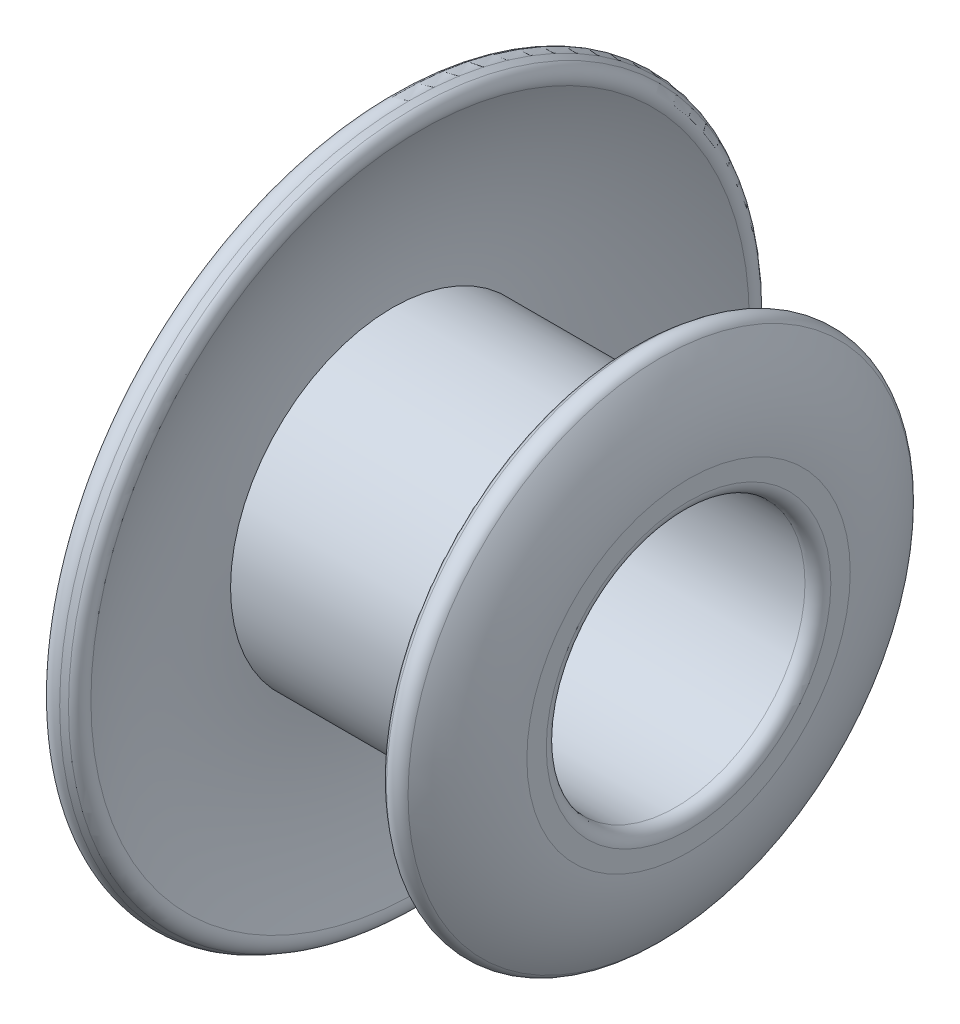
ISO-10303-21;
HEADER;
FILE_DESCRIPTION(('STEP AP214'),'2;1');
FILE_NAME('part.step','',(''),(''),'','','');
FILE_SCHEMA(('AUTOMOTIVE_DESIGN { 1 0 10303 214 1 1 1 1 }'));
ENDSEC;
DATA;
#1=APPLICATION_CONTEXT('core data for automotive mechanical design processes');
#2=APPLICATION_PROTOCOL_DEFINITION('international standard','automotive_design',2000,#1);
#3=PRODUCT_CONTEXT('',#1,'mechanical');
#4=PRODUCT('Part','Part','',(#3));
#5=PRODUCT_RELATED_PRODUCT_CATEGORY('part','',(#4));
#6=PRODUCT_DEFINITION_FORMATION('','',#4);
#7=PRODUCT_DEFINITION_CONTEXT('part definition',#1,'design');
#8=PRODUCT_DEFINITION('design','',#6,#7);
#9=PRODUCT_DEFINITION_SHAPE('','',#8);
#10=(LENGTH_UNIT() NAMED_UNIT(*) SI_UNIT(.MILLI.,.METRE.));
#11=(NAMED_UNIT(*) PLANE_ANGLE_UNIT() SI_UNIT($,.RADIAN.));
#12=(NAMED_UNIT(*) SI_UNIT($,.STERADIAN.) SOLID_ANGLE_UNIT());
#13=UNCERTAINTY_MEASURE_WITH_UNIT(LENGTH_MEASURE(1.E-05),#10,'distance_accuracy_value','');
#14=(GEOMETRIC_REPRESENTATION_CONTEXT(3) GLOBAL_UNCERTAINTY_ASSIGNED_CONTEXT((#13)) GLOBAL_UNIT_ASSIGNED_CONTEXT((#10,
#11,#12)) REPRESENTATION_CONTEXT('',''));
#15=CARTESIAN_POINT('',(0.,0.,0.));
#16=DIRECTION('',(0.,0.,1.));
#17=DIRECTION('',(1.,0.,0.));
#18=AXIS2_PLACEMENT_3D('',#15,#16,#17);
#19=CARTESIAN_POINT('',(-1.,0.,0.));
#20=DIRECTION('',(1.,0.,0.));
#21=DIRECTION('',(0.,0.,-1.));
#22=AXIS2_PLACEMENT_3D('',#19,#20,#21);
#23=TOROIDAL_SURFACE('',#22,1.25,1.);
#24=CARTESIAN_POINT('',(-0.170578942903163,0.,0.));
#25=DIRECTION('',(-1.,0.,0.));
#26=DIRECTION('',(0.,0.,1.));
#27=AXIS2_PLACEMENT_3D('',#24,#25,#26);
#28=CIRCLE('',#27,1.80862394331461);
#29=CARTESIAN_POINT('',(-0.170578942903163,0.,1.80862394331461));
#30=VERTEX_POINT('',#29);
#31=EDGE_CURVE('E47',#30,#30,#28,.T.);
#32=ORIENTED_EDGE('',*,*,#31,.T.);
#33=EDGE_LOOP('',(#32));
#34=FACE_BOUND('',#33,.T.);
#35=CARTESIAN_POINT('',(0.,0.,0.));
#36=DIRECTION('',(1.,0.,0.));
#37=DIRECTION('',(0.,0.,-1.));
#38=AXIS2_PLACEMENT_3D('',#35,#36,#37);
#39=CIRCLE('',#38,1.25);
#40=CARTESIAN_POINT('',(0.,0.,-1.25));
#41=VERTEX_POINT('',#40);
#42=EDGE_CURVE('E76',#41,#41,#39,.T.);
#43=ORIENTED_EDGE('',*,*,#42,.T.);
#44=EDGE_LOOP('',(#43));
#45=FACE_BOUND('',#44,.T.);
#46=ADVANCED_FACE('F32',(#34,#45),#23,.F.);
#47=CARTESIAN_POINT('',(0.,0.,0.));
#48=DIRECTION('',(1.,0.,0.));
#49=DIRECTION('',(0.,0.,-1.));
#50=AXIS2_PLACEMENT_3D('',#47,#48,#49);
#51=CYLINDRICAL_SURFACE('',#50,1.25);
#52=CARTESIAN_POINT('',(-2.04063984282907,0.,0.));
#53=DIRECTION('',(1.,0.,0.));
#54=DIRECTION('',(0.,0.,-1.));
#55=AXIS2_PLACEMENT_3D('',#52,#53,#54);
#56=CIRCLE('',#55,1.25);
#57=CARTESIAN_POINT('',(-2.04063984282907,0.,-1.25));
#58=VERTEX_POINT('',#57);
#59=EDGE_CURVE('E79',#58,#58,#56,.T.);
#60=ORIENTED_EDGE('',*,*,#59,.T.);
#61=EDGE_LOOP('',(#60));
#62=FACE_BOUND('',#61,.T.);
#63=ORIENTED_EDGE('',*,*,#42,.F.);
#64=EDGE_LOOP('',(#63));
#65=FACE_BOUND('',#64,.T.);
#66=ADVANCED_FACE('F104',(#62,#65),#51,.T.);
#67=CARTESIAN_POINT('',(0.190032397181517,0.,0.));
#68=DIRECTION('',(1.,0.,0.));
#69=DIRECTION('',(0.,0.,-1.));
#70=AXIS2_PLACEMENT_3D('',#67,#68,#69);
#71=DEGENERATE_TOROIDAL_SURFACE('',#70,1.54428108611693,2.25,.T.);
#72=CARTESIAN_POINT('',(-1.82538787646011,0.,0.));
#73=DIRECTION('',(1.,0.,0.));
#74=DIRECTION('',(0.,0.,-1.));
#75=AXIS2_PLACEMENT_3D('',#72,#73,#74);
#76=CIRCLE('',#75,2.54457160421371);
#77=CARTESIAN_POINT('',(-1.82538787646011,0.,-2.54457160421371));
#78=VERTEX_POINT('',#77);
#79=EDGE_CURVE('E10',#78,#78,#76,.T.);
#80=ORIENTED_EDGE('',*,*,#79,.T.);
#81=EDGE_LOOP('',(#80));
#82=FACE_BOUND('',#81,.T.);
#83=ORIENTED_EDGE('',*,*,#59,.F.);
#84=EDGE_LOOP('',(#83));
#85=FACE_BOUND('',#84,.T.);
#86=ADVANCED_FACE('F110',(#82,#85),#71,.F.);
#87=CARTESIAN_POINT('',(-2.,0.,0.));
#88=DIRECTION('',(-1.,0.,0.));
#89=DIRECTION('',(0.,0.,1.));
#90=AXIS2_PLACEMENT_3D('',#87,#88,#89);
#91=CONICAL_SURFACE('',#90,2.75,0.503264178510874);
#92=CARTESIAN_POINT('',(-1.91057288431433,0.,0.));
#93=DIRECTION('',(1.,0.,0.));
#94=DIRECTION('',(0.,0.,-1.));
#95=AXIS2_PLACEMENT_3D('',#92,#93,#94);
#96=CIRCLE('',#95,2.70076604120789);
#97=CARTESIAN_POINT('',(-1.91057288431433,0.,-2.70076604120789));
#98=VERTEX_POINT('',#97);
#99=EDGE_CURVE('E39',#98,#98,#96,.T.);
#100=ORIENTED_EDGE('',*,*,#99,.T.);
#101=EDGE_LOOP('',(#100));
#102=FACE_BOUND('',#101,.T.);
#103=CARTESIAN_POINT('',(-1.86673335428885,0.,0.));
#104=DIRECTION('',(-1.,0.,0.));
#105=DIRECTION('',(0.,0.,1.));
#106=AXIS2_PLACEMENT_3D('',#103,#104,#105);
#107=CIRCLE('',#106,2.67663025646083);
#108=CARTESIAN_POINT('',(-1.86673335428885,0.,2.67663025646083));
#109=VERTEX_POINT('',#108);
#110=EDGE_CURVE('E43',#109,#109,#107,.T.);
#111=ORIENTED_EDGE('',*,*,#110,.T.);
#112=EDGE_LOOP('',(#111));
#113=FACE_BOUND('',#112,.T.);
#114=ADVANCED_FACE('F142',(#102,#113),#91,.T.);
#115=CARTESIAN_POINT('',(0.190032397181517,0.,0.));
#116=DIRECTION('',(1.,0.,0.));
#117=DIRECTION('',(0.,0.,-1.));
#118=AXIS2_PLACEMENT_3D('',#115,#116,#117);
#119=DEGENERATE_TOROIDAL_SURFACE('',#118,1.54428108611693,2.5,.T.);
#120=CARTESIAN_POINT('',(-2.26675876734259,0.,0.));
#121=DIRECTION('',(1.,0.,0.));
#122=DIRECTION('',(0.,0.,-1.));
#123=AXIS2_PLACEMENT_3D('',#120,#121,#122);
#124=CIRCLE('',#123,1.08148828807846);
#125=CARTESIAN_POINT('',(-2.26675876734259,0.,-1.08148828807846));
#126=VERTEX_POINT('',#125);
#127=EDGE_CURVE('E70',#126,#126,#124,.T.);
#128=ORIENTED_EDGE('',*,*,#127,.T.);
#129=EDGE_LOOP('',(#128));
#130=FACE_BOUND('',#129,.T.);
#131=CARTESIAN_POINT('',(-2.04833639245512,0.,0.));
#132=DIRECTION('',(1.,0.,0.));
#133=DIRECTION('',(0.,0.,-1.));
#134=AXIS2_PLACEMENT_3D('',#131,#132,#133);
#135=CIRCLE('',#134,2.65770156445412);
#136=CARTESIAN_POINT('',(-2.04833639245512,0.,-2.65770156445412));
#137=VERTEX_POINT('',#136);
#138=EDGE_CURVE('E73',#137,#137,#135,.F.);
#139=ORIENTED_EDGE('',*,*,#138,.T.);
#140=EDGE_LOOP('',(#139));
#141=FACE_BOUND('',#140,.T.);
#142=ADVANCED_FACE('F140',(#130,#141),#119,.T.);
#143=CARTESIAN_POINT('',(0.,0.,0.));
#144=DIRECTION('',(1.,0.,0.));
#145=DIRECTION('',(0.,0.,-1.));
#146=AXIS2_PLACEMENT_3D('',#143,#144,#145);
#147=CYLINDRICAL_SURFACE('',#146,1.);
#148=CARTESIAN_POINT('',(-2.16848712076163,0.,0.));
#149=DIRECTION('',(-1.,0.,0.));
#150=DIRECTION('',(0.,0.,1.));
#151=AXIS2_PLACEMENT_3D('',#148,#149,#150);
#152=CIRCLE('',#151,1.);
#153=CARTESIAN_POINT('',(-2.16848712076163,0.,1.));
#154=VERTEX_POINT('',#153);
#155=EDGE_CURVE('E64',#154,#154,#152,.T.);
#156=ORIENTED_EDGE('',*,*,#155,.T.);
#157=EDGE_LOOP('',(#156));
#158=FACE_BOUND('',#157,.T.);
#159=CARTESIAN_POINT('',(0.15,0.,0.));
#160=DIRECTION('',(1.,0.,0.));
#161=DIRECTION('',(0.,0.,-1.));
#162=AXIS2_PLACEMENT_3D('',#159,#160,#161);
#163=CIRCLE('',#162,1.);
#164=CARTESIAN_POINT('',(0.15,0.,-1.));
#165=VERTEX_POINT('',#164);
#166=EDGE_CURVE('E67',#165,#165,#163,.T.);
#167=ORIENTED_EDGE('',*,*,#166,.T.);
#168=EDGE_LOOP('',(#167));
#169=FACE_BOUND('',#168,.T.);
#170=ADVANCED_FACE('F100',(#158,#169),#147,.F.);
#171=CARTESIAN_POINT('',(0.25,0.,0.));
#172=DIRECTION('',(1.,0.,0.));
#173=DIRECTION('',(0.,0.,-1.));
#174=AXIS2_PLACEMENT_3D('',#171,#172,#173);
#175=PLANE('',#174);
#176=CARTESIAN_POINT('',(0.25,0.,0.));
#177=DIRECTION('',(1.,0.,0.));
#178=DIRECTION('',(0.,0.,-1.));
#179=AXIS2_PLACEMENT_3D('',#176,#177,#178);
#180=CIRCLE('',#179,1.1);
#181=CARTESIAN_POINT('',(0.25,0.,-1.1));
#182=VERTEX_POINT('',#181);
#183=EDGE_CURVE('E61',#182,#182,#180,.F.);
#184=ORIENTED_EDGE('',*,*,#183,.T.);
#185=EDGE_LOOP('',(#184));
#186=FACE_BOUND('',#185,.T.);
#187=CARTESIAN_POINT('',(0.25,0.,0.));
#188=DIRECTION('',(1.,0.,0.));
#189=DIRECTION('',(0.,0.,-1.));
#190=AXIS2_PLACEMENT_3D('',#187,#188,#189);
#191=CIRCLE('',#190,1.25);
#192=CARTESIAN_POINT('',(0.25,0.,-1.25));
#193=VERTEX_POINT('',#192);
#194=EDGE_CURVE('E82',#193,#193,#191,.T.);
#195=ORIENTED_EDGE('',*,*,#194,.T.);
#196=EDGE_LOOP('',(#195));
#197=FACE_BOUND('',#196,.T.);
#198=ADVANCED_FACE('F86',(#186,#197),#175,.T.);
#199=CARTESIAN_POINT('',(-1.,0.,0.));
#200=DIRECTION('',(1.,0.,0.));
#201=DIRECTION('',(0.,0.,-1.));
#202=AXIS2_PLACEMENT_3D('',#199,#200,#201);
#203=DEGENERATE_TOROIDAL_SURFACE('',#202,1.25,1.25,.T.);
#204=CARTESIAN_POINT('',(0.0339971841705924,0.,0.));
#205=DIRECTION('',(-1.,0.,0.));
#206=DIRECTION('',(0.,0.,1.));
#207=AXIS2_PLACEMENT_3D('',#204,#205,#206);
#208=CIRCLE('',#207,1.95238865532359);
#209=CARTESIAN_POINT('',(0.0339971841705924,0.,1.95238865532359));
#210=VERTEX_POINT('',#209);
#211=EDGE_CURVE('E58',#210,#210,#208,.F.);
#212=ORIENTED_EDGE('',*,*,#211,.T.);
#213=EDGE_LOOP('',(#212));
#214=FACE_BOUND('',#213,.T.);
#215=ORIENTED_EDGE('',*,*,#194,.F.);
#216=EDGE_LOOP('',(#215));
#217=FACE_BOUND('',#216,.T.);
#218=ADVANCED_FACE('F88',(#214,#217),#203,.T.);
#219=CARTESIAN_POINT('',(-0.0309967602818487,0.,0.));
#220=DIRECTION('',(1.,0.,0.));
#221=DIRECTION('',(0.,0.,-1.));
#222=AXIS2_PLACEMENT_3D('',#219,#220,#221);
#223=CONICAL_SURFACE('',#222,2.03964088129714,0.683760592480567);
#224=CARTESIAN_POINT('',(-0.111893861066826,0.,0.));
#225=DIRECTION('',(-1.,0.,0.));
#226=DIRECTION('',(0.,0.,1.));
#227=AXIS2_PLACEMENT_3D('',#224,#225,#226);
#228=CIRCLE('',#227,1.97371782207516);
#229=CARTESIAN_POINT('',(-0.111893861066826,0.,1.97371782207516));
#230=VERTEX_POINT('',#229);
#231=EDGE_CURVE('E52',#230,#230,#228,.T.);
#232=ORIENTED_EDGE('',*,*,#231,.T.);
#233=EDGE_LOOP('',(#232));
#234=FACE_BOUND('',#233,.T.);
#235=CARTESIAN_POINT('',(-0.150808107697252,0.,0.));
#236=DIRECTION('',(1.,0.,0.));
#237=DIRECTION('',(0.,0.,-1.));
#238=AXIS2_PLACEMENT_3D('',#235,#236,#237);
#239=CIRCLE('',#238,1.94200659682353);
#240=CARTESIAN_POINT('',(-0.150808107697252,0.,-1.94200659682353));
#241=VERTEX_POINT('',#240);
#242=EDGE_CURVE('E55',#241,#241,#239,.T.);
#243=ORIENTED_EDGE('',*,*,#242,.T.);
#244=EDGE_LOOP('',(#243));
#245=FACE_BOUND('',#244,.T.);
#246=ADVANCED_FACE('F90',(#234,#245),#223,.T.);
#247=CARTESIAN_POINT('',(-2.16848712076163,0.,0.));
#248=DIRECTION('',(-1.,0.,0.));
#249=DIRECTION('',(0.,0.,1.));
#250=AXIS2_PLACEMENT_3D('',#247,#248,#249);
#251=TOROIDAL_SURFACE('',#250,1.1,0.1);
#252=ORIENTED_EDGE('',*,*,#155,.F.);
#253=EDGE_LOOP('',(#252));
#254=FACE_BOUND('',#253,.T.);
#255=ORIENTED_EDGE('',*,*,#127,.F.);
#256=EDGE_LOOP('',(#255));
#257=FACE_BOUND('',#256,.T.);
#258=ADVANCED_FACE('F97',(#254,#257),#251,.T.);
#259=CARTESIAN_POINT('',(0.15,0.,0.));
#260=DIRECTION('',(1.,0.,0.));
#261=DIRECTION('',(0.,0.,-1.));
#262=AXIS2_PLACEMENT_3D('',#259,#260,#261);
#263=TOROIDAL_SURFACE('',#262,1.1,0.1);
#264=ORIENTED_EDGE('',*,*,#183,.F.);
#265=EDGE_LOOP('',(#264));
#266=FACE_BOUND('',#265,.T.);
#267=ORIENTED_EDGE('',*,*,#166,.F.);
#268=EDGE_LOOP('',(#267));
#269=FACE_BOUND('',#268,.T.);
#270=ADVANCED_FACE('F118',(#266,#269),#263,.T.);
#271=CARTESIAN_POINT('',(-0.048722590563055,0.,0.));
#272=DIRECTION('',(-1.,0.,0.));
#273=DIRECTION('',(0.,0.,1.));
#274=AXIS2_PLACEMENT_3D('',#271,#272,#273);
#275=TOROIDAL_SURFACE('',#274,1.89619756289771,0.1);
#276=ORIENTED_EDGE('',*,*,#231,.F.);
#277=EDGE_LOOP('',(#276));
#278=FACE_BOUND('',#277,.T.);
#279=ORIENTED_EDGE('',*,*,#211,.F.);
#280=EDGE_LOOP('',(#279));
#281=FACE_BOUND('',#280,.T.);
#282=ADVANCED_FACE('F122',(#278,#281),#275,.T.);
#283=CARTESIAN_POINT('',(-0.0876368371934808,0.,0.));
#284=DIRECTION('',(-1.,0.,0.));
#285=DIRECTION('',(0.,0.,1.));
#286=AXIS2_PLACEMENT_3D('',#283,#284,#285);
#287=TOROIDAL_SURFACE('',#286,1.86448633764607,0.1);
#288=ORIENTED_EDGE('',*,*,#31,.F.);
#289=EDGE_LOOP('',(#288));
#290=FACE_BOUND('',#289,.T.);
#291=ORIENTED_EDGE('',*,*,#242,.F.);
#292=EDGE_LOOP('',(#291));
#293=FACE_BOUND('',#292,.T.);
#294=ADVANCED_FACE('F126',(#290,#293),#287,.T.);
#295=CARTESIAN_POINT('',(-1.95880164086965,0.,0.));
#296=DIRECTION('',(-1.,0.,0.));
#297=DIRECTION('',(0.,0.,1.));
#298=AXIS2_PLACEMENT_3D('',#295,#296,#297);
#299=TOROIDAL_SURFACE('',#298,2.61316474532063,0.1);
#300=ORIENTED_EDGE('',*,*,#138,.F.);
#301=EDGE_LOOP('',(#300));
#302=FACE_BOUND('',#301,.T.);
#303=ORIENTED_EDGE('',*,*,#99,.F.);
#304=EDGE_LOOP('',(#303));
#305=FACE_BOUND('',#304,.T.);
#306=ADVANCED_FACE('F129',(#302,#305),#299,.T.);
#307=CARTESIAN_POINT('',(-1.91496211084418,0.,0.));
#308=DIRECTION('',(-1.,0.,0.));
#309=DIRECTION('',(0.,0.,1.));
#310=AXIS2_PLACEMENT_3D('',#307,#308,#309);
#311=TOROIDAL_SURFACE('',#310,2.58902896057357,0.1);
#312=ORIENTED_EDGE('',*,*,#110,.F.);
#313=EDGE_LOOP('',(#312));
#314=FACE_BOUND('',#313,.T.);
#315=ORIENTED_EDGE('',*,*,#79,.F.);
#316=EDGE_LOOP('',(#315));
#317=FACE_BOUND('',#316,.T.);
#318=ADVANCED_FACE('F34',(#314,#317),#311,.T.);
#319=CLOSED_SHELL('',(#46,#66,#86,#114,#142,#170,#198,#218,#246,#258,#270,#282,#294,#306,#318));
#320=MANIFOLD_SOLID_BREP('B2',#319);
#321=ADVANCED_BREP_SHAPE_REPRESENTATION('',(#18,#320),#14);
#322=SHAPE_DEFINITION_REPRESENTATION(#9,#321);
ENDSEC;
END-ISO-10303-21;
